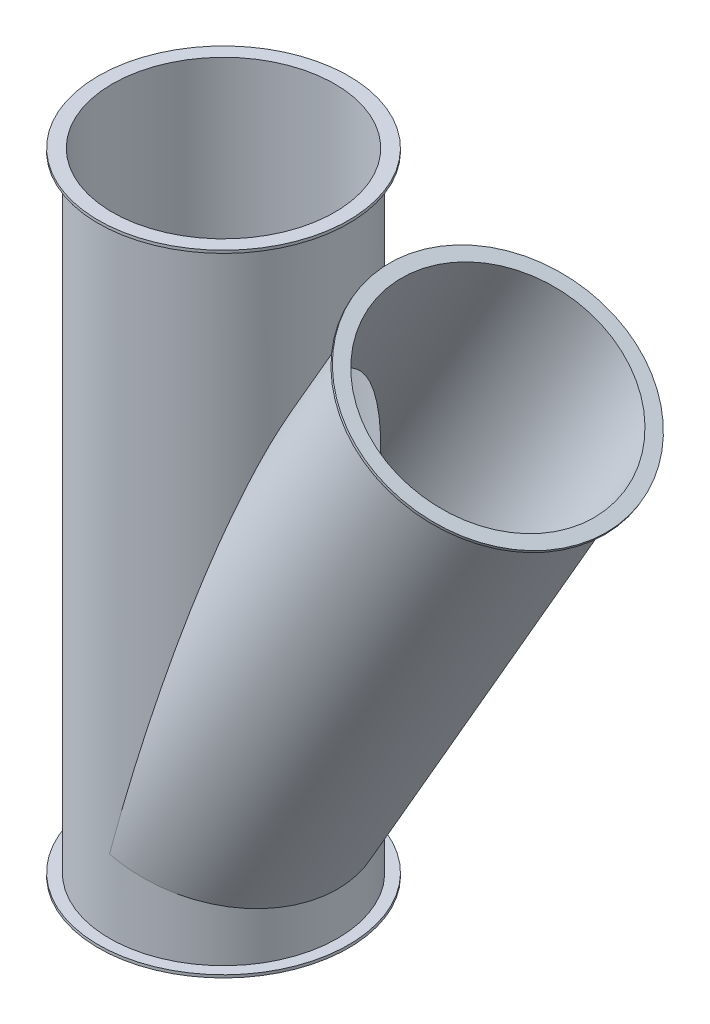
ISO-10303-21;
HEADER;
FILE_DESCRIPTION(('STEP AP214'),'2;1');
FILE_NAME('part.step','',(''),(''),'','','');
FILE_SCHEMA(('AUTOMOTIVE_DESIGN { 1 0 10303 214 1 1 1 1 }'));
ENDSEC;
DATA;
#1=APPLICATION_CONTEXT('core data for automotive mechanical design processes');
#2=APPLICATION_PROTOCOL_DEFINITION('international standard','automotive_design',2000,#1);
#3=PRODUCT_CONTEXT('',#1,'mechanical');
#4=PRODUCT('Part','Part','',(#3));
#5=PRODUCT_RELATED_PRODUCT_CATEGORY('part','',(#4));
#6=PRODUCT_DEFINITION_FORMATION('','',#4);
#7=PRODUCT_DEFINITION_CONTEXT('part definition',#1,'design');
#8=PRODUCT_DEFINITION('design','',#6,#7);
#9=PRODUCT_DEFINITION_SHAPE('','',#8);
#10=(LENGTH_UNIT() NAMED_UNIT(*) SI_UNIT(.MILLI.,.METRE.));
#11=(NAMED_UNIT(*) PLANE_ANGLE_UNIT() SI_UNIT($,.RADIAN.));
#12=(NAMED_UNIT(*) SI_UNIT($,.STERADIAN.) SOLID_ANGLE_UNIT());
#13=UNCERTAINTY_MEASURE_WITH_UNIT(LENGTH_MEASURE(1.E-05),#10,'distance_accuracy_value','');
#14=(GEOMETRIC_REPRESENTATION_CONTEXT(3) GLOBAL_UNCERTAINTY_ASSIGNED_CONTEXT((#13)) GLOBAL_UNIT_ASSIGNED_CONTEXT((#10,
#11,#12)) REPRESENTATION_CONTEXT('',''));
#15=CARTESIAN_POINT('',(0.,0.,0.));
#16=DIRECTION('',(0.,0.,1.));
#17=DIRECTION('',(1.,0.,0.));
#18=AXIS2_PLACEMENT_3D('',#15,#16,#17);
#19=CARTESIAN_POINT('',(-63.75,266.717601775347,0.));
#20=DIRECTION('',(0.,1.,0.));
#21=DIRECTION('',(1.,0.,0.));
#22=AXIS2_PLACEMENT_3D('',#19,#20,#21);
#23=PLANE('',#22);
#24=CARTESIAN_POINT('',(0.,266.717601775347,0.));
#25=DIRECTION('',(0.,1.,0.));
#26=DIRECTION('',(-1.,0.,0.));
#27=AXIS2_PLACEMENT_3D('',#24,#25,#26);
#28=CIRCLE('',#27,60.);
#29=CARTESIAN_POINT('',(-60.,266.717601775347,0.));
#30=VERTEX_POINT('',#29);
#31=EDGE_CURVE('E132',#30,#30,#28,.T.);
#32=ORIENTED_EDGE('',*,*,#31,.F.);
#33=EDGE_LOOP('',(#32));
#34=FACE_BOUND('',#33,.T.);
#35=CARTESIAN_POINT('',(0.,266.717601775347,0.));
#36=DIRECTION('',(0.,1.,0.));
#37=DIRECTION('',(-1.,0.,0.));
#38=AXIS2_PLACEMENT_3D('',#35,#36,#37);
#39=CIRCLE('',#38,67.5);
#40=CARTESIAN_POINT('',(-67.5,266.717601775347,0.));
#41=VERTEX_POINT('',#40);
#42=EDGE_CURVE('E11',#41,#41,#39,.T.);
#43=ORIENTED_EDGE('',*,*,#42,.T.);
#44=EDGE_LOOP('',(#43));
#45=FACE_BOUND('',#44,.T.);
#46=ADVANCED_FACE('F16',(#34,#45),#23,.T.);
#47=CARTESIAN_POINT('',(0.,265.967601775347,0.));
#48=DIRECTION('',(0.,1.,0.));
#49=DIRECTION('',(-1.,0.,0.));
#50=AXIS2_PLACEMENT_3D('',#47,#48,#49);
#51=CYLINDRICAL_SURFACE('',#50,67.5);
#52=CARTESIAN_POINT('',(0.,265.217601775347,0.));
#53=DIRECTION('',(0.,1.,0.));
#54=DIRECTION('',(-1.,0.,0.));
#55=AXIS2_PLACEMENT_3D('',#52,#53,#54);
#56=CIRCLE('',#55,67.5);
#57=CARTESIAN_POINT('',(-67.5,265.217601775347,0.));
#58=VERTEX_POINT('',#57);
#59=EDGE_CURVE('E27',#58,#58,#56,.T.);
#60=ORIENTED_EDGE('',*,*,#59,.T.);
#61=EDGE_LOOP('',(#60));
#62=FACE_BOUND('',#61,.T.);
#63=ORIENTED_EDGE('',*,*,#42,.F.);
#64=EDGE_LOOP('',(#63));
#65=FACE_BOUND('',#64,.T.);
#66=ADVANCED_FACE('F174',(#62,#65),#51,.T.);
#67=CARTESIAN_POINT('',(-64.5,265.217601775347,0.));
#68=DIRECTION('',(0.,-1.,0.));
#69=DIRECTION('',(0.,0.,-1.));
#70=AXIS2_PLACEMENT_3D('',#67,#68,#69);
#71=PLANE('',#70);
#72=CARTESIAN_POINT('',(0.,265.217601775347,0.));
#73=DIRECTION('',(0.,1.,0.));
#74=DIRECTION('',(-1.,0.,0.));
#75=AXIS2_PLACEMENT_3D('',#72,#73,#74);
#76=CIRCLE('',#75,61.5);
#77=CARTESIAN_POINT('',(-61.5,265.217601775347,0.));
#78=VERTEX_POINT('',#77);
#79=EDGE_CURVE('E119',#78,#78,#76,.T.);
#80=ORIENTED_EDGE('',*,*,#79,.T.);
#81=EDGE_LOOP('',(#80));
#82=FACE_BOUND('',#81,.T.);
#83=ORIENTED_EDGE('',*,*,#59,.F.);
#84=EDGE_LOOP('',(#83));
#85=FACE_BOUND('',#84,.T.);
#86=ADVANCED_FACE('F180',(#82,#85),#71,.T.);
#87=CARTESIAN_POINT('',(0.,96.7176017753471,0.));
#88=DIRECTION('',(0.,1.,0.));
#89=DIRECTION('',(-1.,0.,0.));
#90=AXIS2_PLACEMENT_3D('',#87,#88,#89);
#91=CYLINDRICAL_SURFACE('',#90,61.5);
#92=CARTESIAN_POINT('',(0.,-32.2823982246531,0.));
#93=DIRECTION('',(-0.258819045102523,-0.965925826289068,0.));
#94=DIRECTION('',(0.965925826289068,-0.258819045102523,0.));
#95=AXIS2_PLACEMENT_3D('',#92,#93,#94);
#96=ELLIPSE('',#95,63.6694850952201,61.5);
#97=CARTESIAN_POINT('',(0.,-32.2823982246532,-61.5));
#98=VERTEX_POINT('',#97);
#99=CARTESIAN_POINT('',(0.,-32.2823982246532,61.5));
#100=VERTEX_POINT('',#99);
#101=EDGE_CURVE('E128',#98,#100,#96,.T.);
#102=ORIENTED_EDGE('',*,*,#101,.T.);
#103=CARTESIAN_POINT('',(0.,-32.2823982246532,0.));
#104=DIRECTION('',(-0.965925826289068,0.258819045102521,0.));
#105=DIRECTION('',(-0.258819045102521,-0.965925826289068,0.));
#106=AXIS2_PLACEMENT_3D('',#103,#104,#105);
#107=ELLIPSE('',#106,237.617753267111,61.5);
#108=EDGE_CURVE('E122',#100,#98,#107,.T.);
#109=ORIENTED_EDGE('',*,*,#108,.T.);
#110=EDGE_LOOP('',(#102,#109));
#111=FACE_BOUND('',#110,.T.);
#112=ORIENTED_EDGE('',*,*,#79,.F.);
#113=EDGE_LOOP('',(#112));
#114=FACE_BOUND('',#113,.T.);
#115=CARTESIAN_POINT('',(0.,-71.7823982246529,0.));
#116=DIRECTION('',(0.,1.,0.));
#117=DIRECTION('',(-1.,0.,0.));
#118=AXIS2_PLACEMENT_3D('',#115,#116,#117);
#119=CIRCLE('',#118,61.5);
#120=CARTESIAN_POINT('',(-61.5,-71.7823982246529,0.));
#121=VERTEX_POINT('',#120);
#122=EDGE_CURVE('E85',#121,#121,#119,.T.);
#123=ORIENTED_EDGE('',*,*,#122,.T.);
#124=EDGE_LOOP('',(#123));
#125=FACE_BOUND('',#124,.T.);
#126=ADVANCED_FACE('F187',(#111,#114,#125),#91,.T.);
#127=CARTESIAN_POINT('',(148.,224.061121295541,0.));
#128=DIRECTION('',(-0.5,-0.866025403784439,0.));
#129=DIRECTION('',(-0.866025403784439,0.5,0.));
#130=AXIS2_PLACEMENT_3D('',#127,#128,#129);
#131=PLANE('',#130);
#132=CARTESIAN_POINT('',(148.,224.061121295541,0.));
#133=DIRECTION('',(-0.5,-0.866025403784439,0.));
#134=DIRECTION('',(-0.866025403784439,0.5,0.));
#135=AXIS2_PLACEMENT_3D('',#132,#133,#134);
#136=CIRCLE('',#135,60.);
#137=CARTESIAN_POINT('',(199.961524227066,194.061121295541,0.));
#138=VERTEX_POINT('',#137);
#139=EDGE_CURVE('E20',#138,#138,#136,.T.);
#140=ORIENTED_EDGE('',*,*,#139,.T.);
#141=EDGE_LOOP('',(#140));
#142=FACE_BOUND('',#141,.T.);
#143=CARTESIAN_POINT('',(148.,224.061121295541,0.));
#144=DIRECTION('',(-0.5,-0.866025403784439,0.));
#145=DIRECTION('',(-0.866025403784439,0.5,0.));
#146=AXIS2_PLACEMENT_3D('',#143,#144,#145);
#147=CIRCLE('',#146,67.5);
#148=CARTESIAN_POINT('',(206.456714755449,190.311121295541,0.));
#149=VERTEX_POINT('',#148);
#150=EDGE_CURVE('E117',#149,#149,#147,.T.);
#151=ORIENTED_EDGE('',*,*,#150,.F.);
#152=EDGE_LOOP('',(#151));
#153=FACE_BOUND('',#152,.T.);
#154=ADVANCED_FACE('F156',(#142,#153),#131,.F.);
#155=CARTESIAN_POINT('',(148.,224.061121295541,0.));
#156=DIRECTION('',(-0.5,-0.866025403784439,0.));
#157=DIRECTION('',(0.866025403784439,-0.5,0.));
#158=AXIS2_PLACEMENT_3D('',#155,#156,#157);
#159=CYLINDRICAL_SURFACE('',#158,61.5);
#160=ORIENTED_EDGE('',*,*,#101,.F.);
#161=ORIENTED_EDGE('',*,*,#108,.F.);
#162=EDGE_LOOP('',(#160,#161));
#163=FACE_BOUND('',#162,.T.);
#164=CARTESIAN_POINT('',(147.25,222.762083189864,0.));
#165=DIRECTION('',(-0.5,-0.866025403784439,0.));
#166=DIRECTION('',(0.866025403784439,-0.5,0.));
#167=AXIS2_PLACEMENT_3D('',#164,#165,#166);
#168=CIRCLE('',#167,61.5);
#169=CARTESIAN_POINT('',(200.510562332743,192.012083189865,0.));
#170=VERTEX_POINT('',#169);
#171=EDGE_CURVE('E111',#170,#170,#168,.T.);
#172=ORIENTED_EDGE('',*,*,#171,.T.);
#173=EDGE_LOOP('',(#172));
#174=FACE_BOUND('',#173,.T.);
#175=ADVANCED_FACE('F190',(#163,#174),#159,.T.);
#176=CARTESIAN_POINT('',(0.,96.7176017753471,0.));
#177=DIRECTION('',(0.,1.,0.));
#178=DIRECTION('',(-1.,0.,0.));
#179=AXIS2_PLACEMENT_3D('',#176,#177,#178);
#180=CYLINDRICAL_SURFACE('',#179,60.);
#181=CARTESIAN_POINT('',(0.,-32.2823982246532,0.));
#182=DIRECTION('',(0.965925826289068,-0.258819045102521,0.));
#183=DIRECTION('',(0.258819045102521,0.965925826289068,0.));
#184=AXIS2_PLACEMENT_3D('',#181,#182,#183);
#185=ELLIPSE('',#184,231.822198309377,60.);
#186=CARTESIAN_POINT('',(0.,-32.2823982246532,-60.));
#187=VERTEX_POINT('',#186);
#188=CARTESIAN_POINT('',(0.,-32.2823982246532,60.));
#189=VERTEX_POINT('',#188);
#190=EDGE_CURVE('E102',#187,#189,#185,.T.);
#191=ORIENTED_EDGE('',*,*,#190,.T.);
#192=CARTESIAN_POINT('',(0.,-32.2823982246532,0.));
#193=DIRECTION('',(0.258819045102521,0.965925826289068,0.));
#194=DIRECTION('',(-0.965925826289068,0.258819045102521,0.));
#195=AXIS2_PLACEMENT_3D('',#192,#193,#194);
#196=ELLIPSE('',#195,62.116570824605,60.);
#197=EDGE_CURVE('E104',#189,#187,#196,.T.);
#198=ORIENTED_EDGE('',*,*,#197,.T.);
#199=EDGE_LOOP('',(#191,#198));
#200=FACE_BOUND('',#199,.T.);
#201=ORIENTED_EDGE('',*,*,#31,.T.);
#202=EDGE_LOOP('',(#201));
#203=FACE_BOUND('',#202,.T.);
#204=CARTESIAN_POINT('',(0.,-73.2823982246529,0.));
#205=DIRECTION('',(0.,1.,0.));
#206=DIRECTION('',(-1.,0.,0.));
#207=AXIS2_PLACEMENT_3D('',#204,#205,#206);
#208=CIRCLE('',#207,60.);
#209=CARTESIAN_POINT('',(-60.,-73.2823982246529,0.));
#210=VERTEX_POINT('',#209);
#211=EDGE_CURVE('E140',#210,#210,#208,.T.);
#212=ORIENTED_EDGE('',*,*,#211,.F.);
#213=EDGE_LOOP('',(#212));
#214=FACE_BOUND('',#213,.T.);
#215=ADVANCED_FACE('F108',(#200,#203,#214),#180,.F.);
#216=CARTESIAN_POINT('',(-63.75,-73.2823982246529,0.));
#217=DIRECTION('',(0.,-1.,0.));
#218=DIRECTION('',(0.,0.,-1.));
#219=AXIS2_PLACEMENT_3D('',#216,#217,#218);
#220=PLANE('',#219);
#221=ORIENTED_EDGE('',*,*,#211,.T.);
#222=EDGE_LOOP('',(#221));
#223=FACE_BOUND('',#222,.T.);
#224=CARTESIAN_POINT('',(0.,-73.2823982246529,0.));
#225=DIRECTION('',(0.,1.,0.));
#226=DIRECTION('',(-1.,0.,0.));
#227=AXIS2_PLACEMENT_3D('',#224,#225,#226);
#228=CIRCLE('',#227,67.5);
#229=CARTESIAN_POINT('',(-67.5,-73.2823982246529,0.));
#230=VERTEX_POINT('',#229);
#231=EDGE_CURVE('E135',#230,#230,#228,.T.);
#232=ORIENTED_EDGE('',*,*,#231,.F.);
#233=EDGE_LOOP('',(#232));
#234=FACE_BOUND('',#233,.T.);
#235=ADVANCED_FACE('F197',(#223,#234),#220,.T.);
#236=CARTESIAN_POINT('',(0.,-72.5323982246529,0.));
#237=DIRECTION('',(0.,1.,0.));
#238=DIRECTION('',(-1.,0.,0.));
#239=AXIS2_PLACEMENT_3D('',#236,#237,#238);
#240=CYLINDRICAL_SURFACE('',#239,67.5);
#241=ORIENTED_EDGE('',*,*,#231,.T.);
#242=EDGE_LOOP('',(#241));
#243=FACE_BOUND('',#242,.T.);
#244=CARTESIAN_POINT('',(0.,-71.7823982246529,0.));
#245=DIRECTION('',(0.,1.,0.));
#246=DIRECTION('',(-1.,0.,0.));
#247=AXIS2_PLACEMENT_3D('',#244,#245,#246);
#248=CIRCLE('',#247,67.5);
#249=CARTESIAN_POINT('',(-67.5,-71.7823982246529,0.));
#250=VERTEX_POINT('',#249);
#251=EDGE_CURVE('E94',#250,#250,#248,.T.);
#252=ORIENTED_EDGE('',*,*,#251,.F.);
#253=EDGE_LOOP('',(#252));
#254=FACE_BOUND('',#253,.T.);
#255=ADVANCED_FACE('F170',(#243,#254),#240,.T.);
#256=CARTESIAN_POINT('',(-64.5,-71.7823982246529,0.));
#257=DIRECTION('',(0.,1.,0.));
#258=DIRECTION('',(1.,0.,0.));
#259=AXIS2_PLACEMENT_3D('',#256,#257,#258);
#260=PLANE('',#259);
#261=ORIENTED_EDGE('',*,*,#122,.F.);
#262=EDGE_LOOP('',(#261));
#263=FACE_BOUND('',#262,.T.);
#264=ORIENTED_EDGE('',*,*,#251,.T.);
#265=EDGE_LOOP('',(#264));
#266=FACE_BOUND('',#265,.T.);
#267=ADVANCED_FACE('F161',(#263,#266),#260,.T.);
#268=CARTESIAN_POINT('',(148.,224.061121295541,0.));
#269=DIRECTION('',(-0.5,-0.866025403784439,0.));
#270=DIRECTION('',(-0.866025403784439,0.5,0.));
#271=AXIS2_PLACEMENT_3D('',#268,#269,#270);
#272=CYLINDRICAL_SURFACE('',#271,60.);
#273=ORIENTED_EDGE('',*,*,#139,.F.);
#274=EDGE_LOOP('',(#273));
#275=FACE_BOUND('',#274,.T.);
#276=ORIENTED_EDGE('',*,*,#197,.F.);
#277=ORIENTED_EDGE('',*,*,#190,.F.);
#278=EDGE_LOOP('',(#276,#277));
#279=FACE_BOUND('',#278,.T.);
#280=ADVANCED_FACE('F18',(#275,#279),#272,.F.);
#281=CARTESIAN_POINT('',(147.25,222.762083189864,0.));
#282=DIRECTION('',(-0.5,-0.866025403784439,0.));
#283=DIRECTION('',(-0.866025403784439,0.5,0.));
#284=AXIS2_PLACEMENT_3D('',#281,#282,#283);
#285=PLANE('',#284);
#286=ORIENTED_EDGE('',*,*,#171,.F.);
#287=EDGE_LOOP('',(#286));
#288=FACE_BOUND('',#287,.T.);
#289=CARTESIAN_POINT('',(147.25,222.762083189864,0.));
#290=DIRECTION('',(0.5,0.866025403784439,0.));
#291=DIRECTION('',(-0.866025403784439,0.5,0.));
#292=AXIS2_PLACEMENT_3D('',#289,#290,#291);
#293=CIRCLE('',#292,67.5);
#294=CARTESIAN_POINT('',(205.706714755449,189.012083189865,0.));
#295=VERTEX_POINT('',#294);
#296=EDGE_CURVE('E125',#295,#295,#293,.T.);
#297=ORIENTED_EDGE('',*,*,#296,.F.);
#298=EDGE_LOOP('',(#297));
#299=FACE_BOUND('',#298,.T.);
#300=ADVANCED_FACE('F160',(#288,#299),#285,.T.);
#301=CARTESIAN_POINT('',(148.,224.061121295541,0.));
#302=DIRECTION('',(-0.5,-0.86602540378444,0.));
#303=DIRECTION('',(-0.86602540378444,0.5,0.));
#304=AXIS2_PLACEMENT_3D('',#301,#302,#303);
#305=CYLINDRICAL_SURFACE('',#304,67.5);
#306=ORIENTED_EDGE('',*,*,#150,.T.);
#307=EDGE_LOOP('',(#306));
#308=FACE_BOUND('',#307,.T.);
#309=ORIENTED_EDGE('',*,*,#296,.T.);
#310=EDGE_LOOP('',(#309));
#311=FACE_BOUND('',#310,.T.);
#312=ADVANCED_FACE('F167',(#308,#311),#305,.T.);
#313=CLOSED_SHELL('',(#46,#66,#86,#126,#154,#175,#215,#235,#255,#267,#280,#300,#312));
#314=MANIFOLD_SOLID_BREP('B1',#313);
#315=ADVANCED_BREP_SHAPE_REPRESENTATION('',(#18,#314),#14);
#316=SHAPE_DEFINITION_REPRESENTATION(#9,#315);
ENDSEC;
END-ISO-10303-21;
